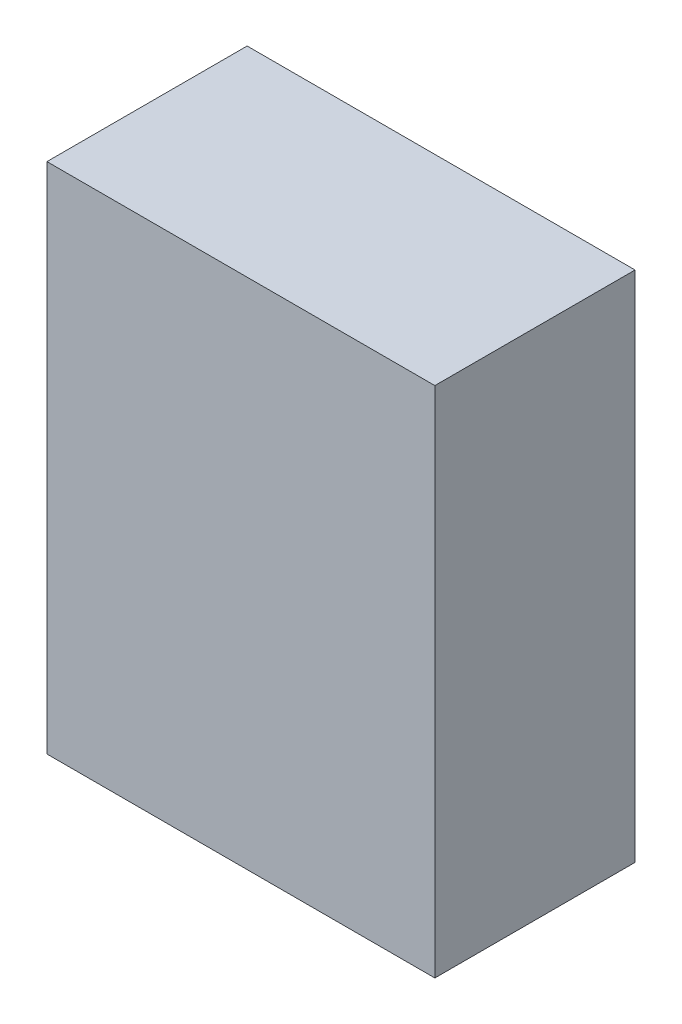
ISO-10303-21;
HEADER;
FILE_DESCRIPTION(('STEP AP214'),'2;1');
FILE_NAME('part.step','',(''),(''),'','','');
FILE_SCHEMA(('AUTOMOTIVE_DESIGN { 1 0 10303 214 1 1 1 1 }'));
ENDSEC;
DATA;
#1=APPLICATION_CONTEXT('core data for automotive mechanical design processes');
#2=APPLICATION_PROTOCOL_DEFINITION('international standard','automotive_design',2000,#1);
#3=PRODUCT_CONTEXT('',#1,'mechanical');
#4=PRODUCT('Part','Part','',(#3));
#5=PRODUCT_RELATED_PRODUCT_CATEGORY('part','',(#4));
#6=PRODUCT_DEFINITION_FORMATION('','',#4);
#7=PRODUCT_DEFINITION_CONTEXT('part definition',#1,'design');
#8=PRODUCT_DEFINITION('design','',#6,#7);
#9=PRODUCT_DEFINITION_SHAPE('','',#8);
#10=(LENGTH_UNIT() NAMED_UNIT(*) SI_UNIT(.MILLI.,.METRE.));
#11=(NAMED_UNIT(*) PLANE_ANGLE_UNIT() SI_UNIT($,.RADIAN.));
#12=(NAMED_UNIT(*) SI_UNIT($,.STERADIAN.) SOLID_ANGLE_UNIT());
#13=UNCERTAINTY_MEASURE_WITH_UNIT(LENGTH_MEASURE(1.E-05),#10,'distance_accuracy_value','');
#14=(GEOMETRIC_REPRESENTATION_CONTEXT(3) GLOBAL_UNCERTAINTY_ASSIGNED_CONTEXT((#13)) GLOBAL_UNIT_ASSIGNED_CONTEXT((#10,
#11,#12)) REPRESENTATION_CONTEXT('',''));
#15=CARTESIAN_POINT('',(0.,0.,0.));
#16=DIRECTION('',(0.,0.,1.));
#17=DIRECTION('',(1.,0.,0.));
#18=AXIS2_PLACEMENT_3D('',#15,#16,#17);
#19=CARTESIAN_POINT('',(0.,0.,0.));
#20=DIRECTION('',(0.,0.,1.));
#21=DIRECTION('',(1.,0.,0.));
#22=AXIS2_PLACEMENT_3D('',#19,#20,#21);
#23=PLANE('',#22);
#24=DIRECTION('',(0.,1.,0.));
#25=VECTOR('',#24,1.);
#26=CARTESIAN_POINT('',(610.,9.9999999999999,0.));
#27=LINE('',#26,#25);
#28=CARTESIAN_POINT('',(610.,-810.,0.));
#29=VERTEX_POINT('',#28);
#30=CARTESIAN_POINT('',(610.,9.9999999999999,0.));
#31=VERTEX_POINT('',#30);
#32=EDGE_CURVE('E187',#29,#31,#27,.T.);
#33=ORIENTED_EDGE('',*,*,#32,.F.);
#34=DIRECTION('',(1.,0.,0.));
#35=VECTOR('',#34,1.);
#36=CARTESIAN_POINT('',(-10.0000000000001,-810.,0.));
#37=LINE('',#36,#35);
#38=CARTESIAN_POINT('',(-10.0000000000001,-810.,0.));
#39=VERTEX_POINT('',#38);
#40=EDGE_CURVE('E196',#39,#29,#37,.T.);
#41=ORIENTED_EDGE('',*,*,#40,.F.);
#42=DIRECTION('',(0.,-1.,0.));
#43=VECTOR('',#42,1.);
#44=CARTESIAN_POINT('',(-10.0000000000002,9.9999999999999,0.));
#45=LINE('',#44,#43);
#46=CARTESIAN_POINT('',(-10.0000000000002,9.9999999999999,0.));
#47=VERTEX_POINT('',#46);
#48=EDGE_CURVE('E120',#47,#39,#45,.T.);
#49=ORIENTED_EDGE('',*,*,#48,.F.);
#50=DIRECTION('',(-1.,0.,0.));
#51=VECTOR('',#50,1.);
#52=CARTESIAN_POINT('',(-10.0000000000002,9.9999999999999,0.));
#53=LINE('',#52,#51);
#54=EDGE_CURVE('E191',#31,#47,#53,.T.);
#55=ORIENTED_EDGE('',*,*,#54,.F.);
#56=EDGE_LOOP('',(#33,#41,#49,#55));
#57=FACE_BOUND('',#56,.T.);
#58=DIRECTION('',(0.,-1.,0.));
#59=VECTOR('',#58,1.);
#60=CARTESIAN_POINT('',(0.,0.,0.));
#61=LINE('',#60,#59);
#62=CARTESIAN_POINT('',(0.,0.,0.));
#63=VERTEX_POINT('',#62);
#64=CARTESIAN_POINT('',(0.,-800.,0.));
#65=VERTEX_POINT('',#64);
#66=EDGE_CURVE('E69',#63,#65,#61,.T.);
#67=ORIENTED_EDGE('',*,*,#66,.T.);
#68=DIRECTION('',(1.,0.,0.));
#69=VECTOR('',#68,1.);
#70=CARTESIAN_POINT('',(0.,-800.,0.));
#71=LINE('',#70,#69);
#72=CARTESIAN_POINT('',(600.,-800.,0.));
#73=VERTEX_POINT('',#72);
#74=EDGE_CURVE('E165',#65,#73,#71,.T.);
#75=ORIENTED_EDGE('',*,*,#74,.T.);
#76=DIRECTION('',(0.,1.,0.));
#77=VECTOR('',#76,1.);
#78=CARTESIAN_POINT('',(600.,0.,0.));
#79=LINE('',#78,#77);
#80=CARTESIAN_POINT('',(600.,0.,0.));
#81=VERTEX_POINT('',#80);
#82=EDGE_CURVE('E169',#73,#81,#79,.T.);
#83=ORIENTED_EDGE('',*,*,#82,.T.);
#84=DIRECTION('',(-1.,0.,0.));
#85=VECTOR('',#84,1.);
#86=CARTESIAN_POINT('',(0.,0.,0.));
#87=LINE('',#86,#85);
#88=EDGE_CURVE('E152',#81,#63,#87,.T.);
#89=ORIENTED_EDGE('',*,*,#88,.T.);
#90=EDGE_LOOP('',(#67,#75,#83,#89));
#91=FACE_BOUND('',#90,.T.);
#92=ADVANCED_FACE('F45',(#57,#91),#23,.F.);
#93=CARTESIAN_POINT('',(610.,9.9999999999999,300.));
#94=DIRECTION('',(-1.,0.,0.));
#95=DIRECTION('',(0.,0.,1.));
#96=AXIS2_PLACEMENT_3D('',#93,#94,#95);
#97=PLANE('',#96);
#98=ORIENTED_EDGE('',*,*,#32,.T.);
#99=DIRECTION('',(0.,0.,-1.));
#100=VECTOR('',#99,1.);
#101=CARTESIAN_POINT('',(610.,9.9999999999999,300.));
#102=LINE('',#101,#100);
#103=CARTESIAN_POINT('',(610.,10.0000000000001,320.));
#104=VERTEX_POINT('',#103);
#105=EDGE_CURVE('E11',#104,#31,#102,.T.);
#106=ORIENTED_EDGE('',*,*,#105,.F.);
#107=DIRECTION('',(0.,1.,0.));
#108=VECTOR('',#107,1.);
#109=CARTESIAN_POINT('',(610.,10.0000000000001,320.));
#110=LINE('',#109,#108);
#111=CARTESIAN_POINT('',(610.,-810.,320.));
#112=VERTEX_POINT('',#111);
#113=EDGE_CURVE('E134',#112,#104,#110,.T.);
#114=ORIENTED_EDGE('',*,*,#113,.F.);
#115=DIRECTION('',(0.,0.,-1.));
#116=VECTOR('',#115,1.);
#117=CARTESIAN_POINT('',(610.,-810.,300.));
#118=LINE('',#117,#116);
#119=EDGE_CURVE('E124',#112,#29,#118,.T.);
#120=ORIENTED_EDGE('',*,*,#119,.T.);
#121=EDGE_LOOP('',(#98,#106,#114,#120));
#122=FACE_BOUND('',#121,.T.);
#123=ADVANCED_FACE('F47',(#122),#97,.F.);
#124=CARTESIAN_POINT('',(-10.0000000000002,9.9999999999999,300.));
#125=DIRECTION('',(0.,-1.,0.));
#126=DIRECTION('',(0.,0.,-1.));
#127=AXIS2_PLACEMENT_3D('',#124,#125,#126);
#128=PLANE('',#127);
#129=ORIENTED_EDGE('',*,*,#54,.T.);
#130=DIRECTION('',(0.,0.,-1.));
#131=VECTOR('',#130,1.);
#132=CARTESIAN_POINT('',(-10.0000000000002,9.9999999999999,300.));
#133=LINE('',#132,#131);
#134=CARTESIAN_POINT('',(-10.0000000000001,10.0000000000001,320.));
#135=VERTEX_POINT('',#134);
#136=EDGE_CURVE('E54',#135,#47,#133,.T.);
#137=ORIENTED_EDGE('',*,*,#136,.F.);
#138=DIRECTION('',(-1.,0.,0.));
#139=VECTOR('',#138,1.);
#140=CARTESIAN_POINT('',(-10.0000000000001,10.0000000000001,320.));
#141=LINE('',#140,#139);
#142=EDGE_CURVE('E139',#104,#135,#141,.T.);
#143=ORIENTED_EDGE('',*,*,#142,.F.);
#144=ORIENTED_EDGE('',*,*,#105,.T.);
#145=EDGE_LOOP('',(#129,#137,#143,#144));
#146=FACE_BOUND('',#145,.T.);
#147=ADVANCED_FACE('F206',(#146),#128,.F.);
#148=CARTESIAN_POINT('',(-10.0000000000002,9.9999999999999,300.));
#149=DIRECTION('',(1.,0.,0.));
#150=DIRECTION('',(0.,1.,0.));
#151=AXIS2_PLACEMENT_3D('',#148,#149,#150);
#152=PLANE('',#151);
#153=ORIENTED_EDGE('',*,*,#48,.T.);
#154=DIRECTION('',(0.,0.,-1.));
#155=VECTOR('',#154,1.);
#156=CARTESIAN_POINT('',(-10.0000000000001,-810.,300.));
#157=LINE('',#156,#155);
#158=CARTESIAN_POINT('',(-10.,-810.,320.));
#159=VERTEX_POINT('',#158);
#160=EDGE_CURVE('E113',#159,#39,#157,.T.);
#161=ORIENTED_EDGE('',*,*,#160,.F.);
#162=DIRECTION('',(0.,-1.,0.));
#163=VECTOR('',#162,1.);
#164=CARTESIAN_POINT('',(-10.0000000000001,10.0000000000001,320.));
#165=LINE('',#164,#163);
#166=EDGE_CURVE('E118',#135,#159,#165,.T.);
#167=ORIENTED_EDGE('',*,*,#166,.F.);
#168=ORIENTED_EDGE('',*,*,#136,.T.);
#169=EDGE_LOOP('',(#153,#161,#167,#168));
#170=FACE_BOUND('',#169,.T.);
#171=ADVANCED_FACE('F115',(#170),#152,.F.);
#172=CARTESIAN_POINT('',(-10.0000000000001,-810.,300.));
#173=DIRECTION('',(0.,1.,0.));
#174=DIRECTION('',(0.,0.,1.));
#175=AXIS2_PLACEMENT_3D('',#172,#173,#174);
#176=PLANE('',#175);
#177=ORIENTED_EDGE('',*,*,#40,.T.);
#178=ORIENTED_EDGE('',*,*,#119,.F.);
#179=DIRECTION('',(1.,0.,0.));
#180=VECTOR('',#179,1.);
#181=CARTESIAN_POINT('',(-10.,-810.,320.));
#182=LINE('',#181,#180);
#183=EDGE_CURVE('E127',#159,#112,#182,.T.);
#184=ORIENTED_EDGE('',*,*,#183,.F.);
#185=ORIENTED_EDGE('',*,*,#160,.T.);
#186=EDGE_LOOP('',(#177,#178,#184,#185));
#187=FACE_BOUND('',#186,.T.);
#188=ADVANCED_FACE('F128',(#187),#176,.F.);
#189=CARTESIAN_POINT('',(0.,0.,300.));
#190=DIRECTION('',(1.,0.,0.));
#191=DIRECTION('',(0.,0.,-1.));
#192=AXIS2_PLACEMENT_3D('',#189,#190,#191);
#193=PLANE('',#192);
#194=ORIENTED_EDGE('',*,*,#66,.F.);
#195=DIRECTION('',(0.,0.,-1.));
#196=VECTOR('',#195,1.);
#197=CARTESIAN_POINT('',(0.,0.,300.));
#198=LINE('',#197,#196);
#199=CARTESIAN_POINT('',(0.,0.,300.));
#200=VERTEX_POINT('',#199);
#201=EDGE_CURVE('E162',#200,#63,#198,.T.);
#202=ORIENTED_EDGE('',*,*,#201,.F.);
#203=DIRECTION('',(0.,-1.,0.));
#204=VECTOR('',#203,1.);
#205=CARTESIAN_POINT('',(0.,0.,300.));
#206=LINE('',#205,#204);
#207=CARTESIAN_POINT('',(0.,-800.,300.));
#208=VERTEX_POINT('',#207);
#209=EDGE_CURVE('E147',#200,#208,#206,.T.);
#210=ORIENTED_EDGE('',*,*,#209,.T.);
#211=DIRECTION('',(0.,0.,-1.));
#212=VECTOR('',#211,1.);
#213=CARTESIAN_POINT('',(0.,-800.,300.));
#214=LINE('',#213,#212);
#215=EDGE_CURVE('E184',#208,#65,#214,.T.);
#216=ORIENTED_EDGE('',*,*,#215,.T.);
#217=EDGE_LOOP('',(#194,#202,#210,#216));
#218=FACE_BOUND('',#217,.T.);
#219=ADVANCED_FACE('F219',(#218),#193,.T.);
#220=CARTESIAN_POINT('',(0.,-800.,300.));
#221=DIRECTION('',(0.,1.,0.));
#222=DIRECTION('',(0.,0.,1.));
#223=AXIS2_PLACEMENT_3D('',#220,#221,#222);
#224=PLANE('',#223);
#225=ORIENTED_EDGE('',*,*,#74,.F.);
#226=ORIENTED_EDGE('',*,*,#215,.F.);
#227=DIRECTION('',(1.,0.,0.));
#228=VECTOR('',#227,1.);
#229=CARTESIAN_POINT('',(0.,-800.,300.));
#230=LINE('',#229,#228);
#231=CARTESIAN_POINT('',(600.,-800.,300.));
#232=VERTEX_POINT('',#231);
#233=EDGE_CURVE('E151',#208,#232,#230,.T.);
#234=ORIENTED_EDGE('',*,*,#233,.T.);
#235=DIRECTION('',(0.,0.,-1.));
#236=VECTOR('',#235,1.);
#237=CARTESIAN_POINT('',(600.,-800.,300.));
#238=LINE('',#237,#236);
#239=EDGE_CURVE('E181',#232,#73,#238,.T.);
#240=ORIENTED_EDGE('',*,*,#239,.T.);
#241=EDGE_LOOP('',(#225,#226,#234,#240));
#242=FACE_BOUND('',#241,.T.);
#243=ADVANCED_FACE('F225',(#242),#224,.T.);
#244=CARTESIAN_POINT('',(600.,0.,300.));
#245=DIRECTION('',(-1.,0.,0.));
#246=DIRECTION('',(0.,0.,1.));
#247=AXIS2_PLACEMENT_3D('',#244,#245,#246);
#248=PLANE('',#247);
#249=ORIENTED_EDGE('',*,*,#82,.F.);
#250=ORIENTED_EDGE('',*,*,#239,.F.);
#251=DIRECTION('',(0.,1.,0.));
#252=VECTOR('',#251,1.);
#253=CARTESIAN_POINT('',(600.,0.,300.));
#254=LINE('',#253,#252);
#255=CARTESIAN_POINT('',(600.,0.,300.));
#256=VERTEX_POINT('',#255);
#257=EDGE_CURVE('E156',#232,#256,#254,.T.);
#258=ORIENTED_EDGE('',*,*,#257,.T.);
#259=DIRECTION('',(0.,0.,-1.));
#260=VECTOR('',#259,1.);
#261=CARTESIAN_POINT('',(600.,0.,300.));
#262=LINE('',#261,#260);
#263=EDGE_CURVE('E178',#256,#81,#262,.T.);
#264=ORIENTED_EDGE('',*,*,#263,.T.);
#265=EDGE_LOOP('',(#249,#250,#258,#264));
#266=FACE_BOUND('',#265,.T.);
#267=ADVANCED_FACE('F229',(#266),#248,.T.);
#268=CARTESIAN_POINT('',(0.,0.,300.));
#269=DIRECTION('',(0.,-1.,0.));
#270=DIRECTION('',(0.,0.,-1.));
#271=AXIS2_PLACEMENT_3D('',#268,#269,#270);
#272=PLANE('',#271);
#273=ORIENTED_EDGE('',*,*,#88,.F.);
#274=ORIENTED_EDGE('',*,*,#263,.F.);
#275=DIRECTION('',(-1.,0.,0.));
#276=VECTOR('',#275,1.);
#277=CARTESIAN_POINT('',(0.,0.,300.));
#278=LINE('',#277,#276);
#279=EDGE_CURVE('E61',#256,#200,#278,.T.);
#280=ORIENTED_EDGE('',*,*,#279,.T.);
#281=ORIENTED_EDGE('',*,*,#201,.T.);
#282=EDGE_LOOP('',(#273,#274,#280,#281));
#283=FACE_BOUND('',#282,.T.);
#284=ADVANCED_FACE('F234',(#283),#272,.T.);
#285=CARTESIAN_POINT('',(0.,0.,300.));
#286=DIRECTION('',(0.,0.,1.));
#287=DIRECTION('',(1.,0.,0.));
#288=AXIS2_PLACEMENT_3D('',#285,#286,#287);
#289=PLANE('',#288);
#290=ORIENTED_EDGE('',*,*,#233,.F.);
#291=ORIENTED_EDGE('',*,*,#209,.F.);
#292=ORIENTED_EDGE('',*,*,#279,.F.);
#293=ORIENTED_EDGE('',*,*,#257,.F.);
#294=EDGE_LOOP('',(#290,#291,#292,#293));
#295=FACE_BOUND('',#294,.T.);
#296=ADVANCED_FACE('F240',(#295),#289,.F.);
#297=CARTESIAN_POINT('',(0.,0.,320.));
#298=DIRECTION('',(0.,0.,1.));
#299=DIRECTION('',(1.,0.,0.));
#300=AXIS2_PLACEMENT_3D('',#297,#298,#299);
#301=PLANE('',#300);
#302=ORIENTED_EDGE('',*,*,#166,.T.);
#303=ORIENTED_EDGE('',*,*,#183,.T.);
#304=ORIENTED_EDGE('',*,*,#113,.T.);
#305=ORIENTED_EDGE('',*,*,#142,.T.);
#306=EDGE_LOOP('',(#302,#303,#304,#305));
#307=FACE_BOUND('',#306,.T.);
#308=ADVANCED_FACE('F137',(#307),#301,.T.);
#309=CLOSED_SHELL('',(#92,#123,#147,#171,#188,#219,#243,#267,#284,#296,#308));
#310=MANIFOLD_SOLID_BREP('B2',#309);
#311=ADVANCED_BREP_SHAPE_REPRESENTATION('',(#18,#310),#14);
#312=SHAPE_DEFINITION_REPRESENTATION(#9,#311);
ENDSEC;
END-ISO-10303-21;
